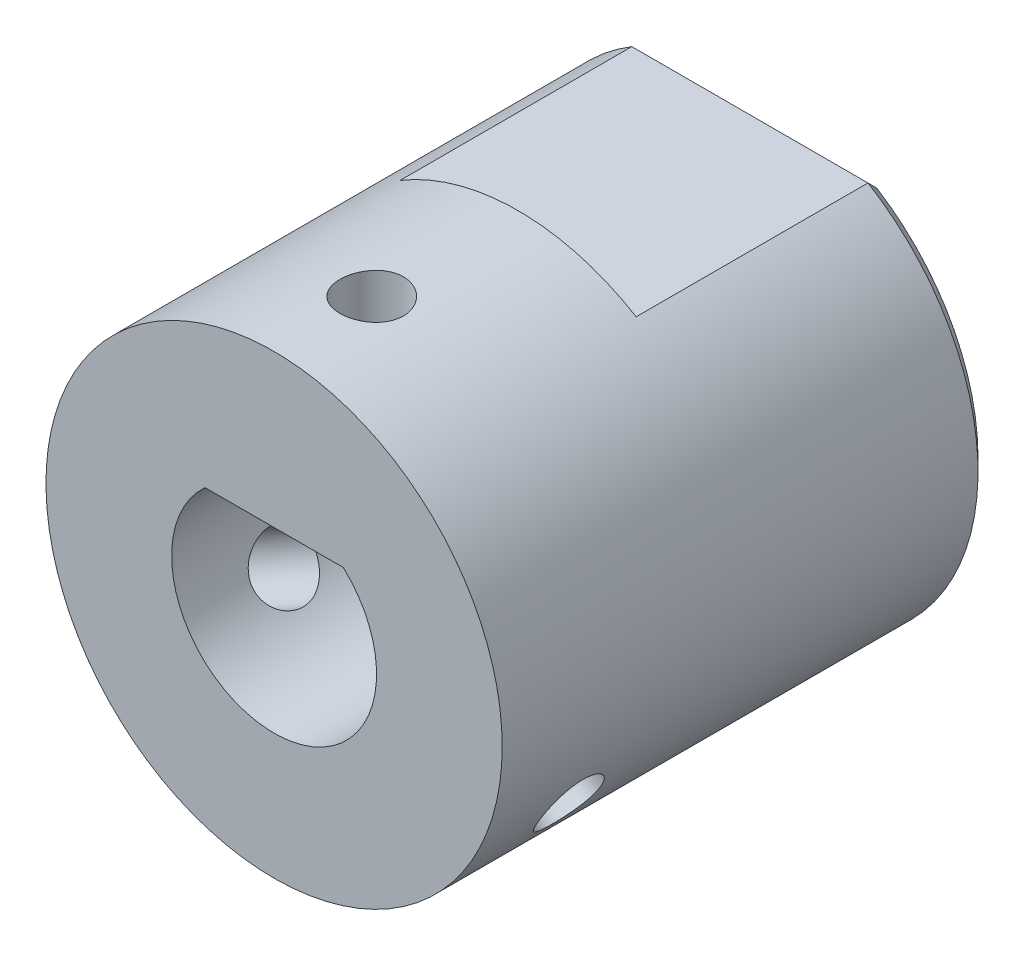
ISO-10303-21;
HEADER;
FILE_DESCRIPTION(('STEP AP214'),'2;1');
FILE_NAME('part.step','',(''),(''),'','','');
FILE_SCHEMA(('AUTOMOTIVE_DESIGN { 1 0 10303 214 1 1 1 1 }'));
ENDSEC;
DATA;
#1=APPLICATION_CONTEXT('core data for automotive mechanical design processes');
#2=APPLICATION_PROTOCOL_DEFINITION('international standard','automotive_design',2000,#1);
#3=PRODUCT_CONTEXT('',#1,'mechanical');
#4=PRODUCT('Part','Part','',(#3));
#5=PRODUCT_RELATED_PRODUCT_CATEGORY('part','',(#4));
#6=PRODUCT_DEFINITION_FORMATION('','',#4);
#7=PRODUCT_DEFINITION_CONTEXT('part definition',#1,'design');
#8=PRODUCT_DEFINITION('design','',#6,#7);
#9=PRODUCT_DEFINITION_SHAPE('','',#8);
#10=(LENGTH_UNIT() NAMED_UNIT(*) SI_UNIT(.MILLI.,.METRE.));
#11=(NAMED_UNIT(*) PLANE_ANGLE_UNIT() SI_UNIT($,.RADIAN.));
#12=(NAMED_UNIT(*) SI_UNIT($,.STERADIAN.) SOLID_ANGLE_UNIT());
#13=UNCERTAINTY_MEASURE_WITH_UNIT(LENGTH_MEASURE(1.E-05),#10,'distance_accuracy_value','');
#14=(GEOMETRIC_REPRESENTATION_CONTEXT(3) GLOBAL_UNCERTAINTY_ASSIGNED_CONTEXT((#13)) GLOBAL_UNIT_ASSIGNED_CONTEXT((#10,
#11,#12)) REPRESENTATION_CONTEXT('',''));
#15=CARTESIAN_POINT('',(0.,0.,0.));
#16=DIRECTION('',(0.,0.,1.));
#17=DIRECTION('',(1.,0.,0.));
#18=AXIS2_PLACEMENT_3D('',#15,#16,#17);
#19=CARTESIAN_POINT('',(0.,0.,20.));
#20=DIRECTION('',(0.,0.,1.));
#21=DIRECTION('',(1.,0.,0.));
#22=AXIS2_PLACEMENT_3D('',#19,#20,#21);
#23=PLANE('',#22);
#24=CARTESIAN_POINT('',(0.,0.,20.));
#25=DIRECTION('',(0.,0.,1.));
#26=DIRECTION('',(1.,0.,0.));
#27=AXIS2_PLACEMENT_3D('',#24,#25,#26);
#28=CIRCLE('',#27,9.35);
#29=CARTESIAN_POINT('',(9.35,0.,20.));
#30=VERTEX_POINT('',#29);
#31=EDGE_CURVE('E241',#30,#30,#28,.T.);
#32=ORIENTED_EDGE('',*,*,#31,.T.);
#33=EDGE_LOOP('',(#32));
#34=FACE_BOUND('',#33,.T.);
#35=CARTESIAN_POINT('',(0.,0.,20.));
#36=DIRECTION('',(0.,0.,1.));
#37=DIRECTION('',(1.,0.,0.));
#38=AXIS2_PLACEMENT_3D('',#35,#36,#37);
#39=CIRCLE('',#38,4.2);
#40=CARTESIAN_POINT('',(-2.83372546306095,3.1,20.));
#41=VERTEX_POINT('',#40);
#42=CARTESIAN_POINT('',(2.83372546306095,3.1,20.));
#43=VERTEX_POINT('',#42);
#44=EDGE_CURVE('E238',#41,#43,#39,.T.);
#45=ORIENTED_EDGE('',*,*,#44,.F.);
#46=DIRECTION('',(1.,0.,0.));
#47=VECTOR('',#46,1.);
#48=CARTESIAN_POINT('',(-2.83372546306095,3.1,20.));
#49=LINE('',#48,#47);
#50=EDGE_CURVE('E218',#41,#43,#49,.T.);
#51=ORIENTED_EDGE('',*,*,#50,.T.);
#52=EDGE_LOOP('',(#45,#51));
#53=FACE_BOUND('',#52,.T.);
#54=ADVANCED_FACE('F43',(#34,#53),#23,.T.);
#55=CARTESIAN_POINT('',(0.,0.,0.));
#56=DIRECTION('',(0.,0.,1.));
#57=DIRECTION('',(1.,0.,0.));
#58=AXIS2_PLACEMENT_3D('',#55,#56,#57);
#59=PLANE('',#58);
#60=DIRECTION('',(1.,0.,0.));
#61=VECTOR('',#60,1.);
#62=CARTESIAN_POINT('',(0.,7.5,0.));
#63=LINE('',#62,#61);
#64=CARTESIAN_POINT('',(-4.69813792900975,7.5,0.));
#65=VERTEX_POINT('',#64);
#66=CARTESIAN_POINT('',(4.69813792900975,7.5,0.));
#67=VERTEX_POINT('',#66);
#68=EDGE_CURVE('E66',#65,#67,#63,.T.);
#69=ORIENTED_EDGE('',*,*,#68,.T.);
#70=CARTESIAN_POINT('',(0.,0.,0.));
#71=DIRECTION('',(0.,0.,1.));
#72=DIRECTION('',(1.,0.,0.));
#73=AXIS2_PLACEMENT_3D('',#70,#71,#72);
#74=CIRCLE('',#73,8.85);
#75=EDGE_CURVE('E59',#67,#65,#74,.F.);
#76=ORIENTED_EDGE('',*,*,#75,.T.);
#77=EDGE_LOOP('',(#69,#76));
#78=FACE_BOUND('',#77,.T.);
#79=CARTESIAN_POINT('',(0.,0.,0.));
#80=DIRECTION('',(0.,0.,1.));
#81=DIRECTION('',(1.,0.,0.));
#82=AXIS2_PLACEMENT_3D('',#79,#80,#81);
#83=CIRCLE('',#82,4.2);
#84=CARTESIAN_POINT('',(4.2,0.,0.));
#85=VERTEX_POINT('',#84);
#86=EDGE_CURVE('E235',#85,#85,#83,.T.);
#87=ORIENTED_EDGE('',*,*,#86,.T.);
#88=EDGE_LOOP('',(#87));
#89=FACE_BOUND('',#88,.T.);
#90=ADVANCED_FACE('F152',(#78,#89),#59,.F.);
#91=CARTESIAN_POINT('',(0.,0.,20.));
#92=DIRECTION('',(0.,0.,-1.));
#93=DIRECTION('',(-1.,0.,0.));
#94=AXIS2_PLACEMENT_3D('',#91,#92,#93);
#95=CYLINDRICAL_SURFACE('',#94,9.35);
#96=CARTESIAN_POINT('',(-7.36868910732917,-5.75542533958424,16.));
#97=CARTESIAN_POINT('',(-7.36869161852359,-5.75542327536056,15.9273580817023));
#98=CARTESIAN_POINT('',(-7.37249205819785,-5.75056663106929,15.8546725031694));
#99=CARTESIAN_POINT('',(-7.38752877458161,-5.73123571250505,15.7113292392381));
#100=CARTESIAN_POINT('',(-7.39877254227632,-5.71675174921273,15.6406736716695));
#101=CARTESIAN_POINT('',(-7.4281713888277,-5.67849873812206,15.5034862737632));
#102=CARTESIAN_POINT('',(-7.44632144628477,-5.65473643605633,15.4369514880746));
#103=CARTESIAN_POINT('',(-7.48872710108576,-5.5984553285125,15.3098130770295));
#104=CARTESIAN_POINT('',(-7.51298176464104,-5.5659378622116,15.2492085465212));
#105=CARTESIAN_POINT('',(-7.56674187650696,-5.49263053118961,15.1352223541864));
#106=CARTESIAN_POINT('',(-7.59627876344121,-5.45179091990007,15.0818875076751));
#107=CARTESIAN_POINT('',(-7.65930656056571,-5.36288043086562,14.9843597717681));
#108=CARTESIAN_POINT('',(-7.69279767829316,-5.31480917353253,14.9401673625472));
#109=CARTESIAN_POINT('',(-7.76259046394222,-5.21234511377049,14.8620082778028));
#110=CARTESIAN_POINT('',(-7.7989031222667,-5.15792713064914,14.8280843964996));
#111=CARTESIAN_POINT('',(-7.872882762299,-5.04428474668086,14.7716997184414));
#112=CARTESIAN_POINT('',(-7.91054968220607,-4.98506056500665,14.7492383993095));
#113=CARTESIAN_POINT('',(-7.98569423778917,-4.8637682730505,14.7165574853382));
#114=CARTESIAN_POINT('',(-8.02317152357426,-4.80172101536436,14.7062597155207));
#115=CARTESIAN_POINT('',(-8.09699915888118,-4.67615306950701,14.6979556900775));
#116=CARTESIAN_POINT('',(-8.13334956254551,-4.61263245238237,14.6999488429961));
#117=CARTESIAN_POINT('',(-8.20365272098632,-4.48639807869262,14.7161079523771));
#118=CARTESIAN_POINT('',(-8.23762028932464,-4.42368177902195,14.730189818852));
#119=CARTESIAN_POINT('',(-8.30261416559337,-4.3004596788589,14.7699948790985));
#120=CARTESIAN_POINT('',(-8.33364040667508,-4.23995392862575,14.7957183373765));
#121=CARTESIAN_POINT('',(-8.39222830625282,-4.12277982747407,14.8581640030411));
#122=CARTESIAN_POINT('',(-8.41977824822696,-4.06612473598641,14.8949220653752));
#123=CARTESIAN_POINT('',(-8.47085916757039,-3.95861000670828,14.9783673814475));
#124=CARTESIAN_POINT('',(-8.49438991708336,-3.90775069754703,15.0250551977874));
#125=CARTESIAN_POINT('',(-8.53733280644675,-3.81302784862582,15.127504352275));
#126=CARTESIAN_POINT('',(-8.55670845159298,-3.76922707598977,15.1833390506139));
#127=CARTESIAN_POINT('',(-8.59091844955918,-3.69059139788764,15.3022465194326));
#128=CARTESIAN_POINT('',(-8.60575278135189,-3.65575653393576,15.3653193234245));
#129=CARTESIAN_POINT('',(-8.63079857185777,-3.59622922549149,15.4969832050296));
#130=CARTESIAN_POINT('',(-8.64100723825642,-3.57154290806992,15.56557758644));
#131=CARTESIAN_POINT('',(-8.6567450367552,-3.53322775971783,15.7062998571695));
#132=CARTESIAN_POINT('',(-8.66227445019601,-3.51959826399654,15.7784275337729));
#133=CARTESIAN_POINT('',(-8.66861100469175,-3.50396275127043,15.9235251581154));
#134=CARTESIAN_POINT('',(-8.66945712517172,-3.50186079101088,15.9964830731419));
#135=CARTESIAN_POINT('',(-8.66652957502623,-3.50909956705879,16.1417337618307));
#136=CARTESIAN_POINT('',(-8.6627560269497,-3.51843999982652,16.2140265530861));
#137=CARTESIAN_POINT('',(-8.6506259847929,-3.54815772103816,16.3555818705303));
#138=CARTESIAN_POINT('',(-8.64228899861504,-3.56848802512971,16.4248559497771));
#139=CARTESIAN_POINT('',(-8.62107519353809,-3.61943634671632,16.5587703985755));
#140=CARTESIAN_POINT('',(-8.60819817982956,-3.65005480566632,16.6234105691461));
#141=CARTESIAN_POINT('',(-8.57787105725553,-3.72076768358883,16.7466841047076));
#142=CARTESIAN_POINT('',(-8.56039177170221,-3.76092239365305,16.8052757012172));
#143=CARTESIAN_POINT('',(-8.52102951761476,-3.84927121357059,16.9143609886034));
#144=CARTESIAN_POINT('',(-8.49914633609116,-3.89746571223994,16.9648542876027));
#145=CARTESIAN_POINT('',(-8.45103497997615,-4.00072100536017,17.0566743471355));
#146=CARTESIAN_POINT('',(-8.4247770223437,-4.05582817729574,17.0979333899061));
#147=CARTESIAN_POINT('',(-8.36840823436111,-4.17089224678479,17.1696434433863));
#148=CARTESIAN_POINT('',(-8.33829749702341,-4.23084902724791,17.2000947149462));
#149=CARTESIAN_POINT('',(-8.2748919712809,-4.35355169540655,17.2492149499628));
#150=CARTESIAN_POINT('',(-8.24160785549086,-4.41628787918661,17.2679219062292));
#151=CARTESIAN_POINT('',(-8.17254121404812,-4.5428253762431,17.2931457579287));
#152=CARTESIAN_POINT('',(-8.13675882933008,-4.60662662928162,17.2996633404244));
#153=CARTESIAN_POINT('',(-8.06397359044995,-4.73287386206785,17.3003084752526));
#154=CARTESIAN_POINT('',(-8.02698356664508,-4.7953267325754,17.2945400051509));
#155=CARTESIAN_POINT('',(-7.95261128694535,-4.917682498107,17.2709984310592));
#156=CARTESIAN_POINT('',(-7.91522903181739,-4.97758539811569,17.2532253505366));
#157=CARTESIAN_POINT('',(-7.84131936401621,-5.09322304245144,17.2062140494977));
#158=CARTESIAN_POINT('',(-7.80479150106602,-5.14896001791176,17.1769820191736));
#159=CARTESIAN_POINT('',(-7.73384807434369,-5.25491811227909,17.1078934999697));
#160=CARTESIAN_POINT('',(-7.69943255946492,-5.30513910353183,17.0680367652795));
#161=CARTESIAN_POINT('',(-7.63372251424288,-5.39926913733651,16.9784500733686));
#162=CARTESIAN_POINT('',(-7.6024554130637,-5.44312396889629,16.9286430311121));
#163=CARTESIAN_POINT('',(-7.54459387773939,-5.52304663826848,16.8207312979333));
#164=CARTESIAN_POINT('',(-7.51800054568014,-5.55911263991374,16.7626246557852));
#165=CARTESIAN_POINT('',(-7.47049249487425,-5.62279580443319,16.6394389072019));
#166=CARTESIAN_POINT('',(-7.44960558447255,-5.65037167338479,16.5743277384333));
#167=CARTESIAN_POINT('',(-7.41462508324013,-5.69619814679963,16.4392383172415));
#168=CARTESIAN_POINT('',(-7.40052428655317,-5.71445864406205,16.3692653181534));
#169=CARTESIAN_POINT('',(-7.38303433132624,-5.73702290061459,16.2491293310254));
#170=CARTESIAN_POINT('',(-7.37766670707216,-5.74391576712819,16.1997160284586));
#171=CARTESIAN_POINT('',(-7.37049324720049,-5.75311767504155,16.1002087392048));
#172=CARTESIAN_POINT('',(-7.36868737488726,-5.75542676366658,16.0501147595359));
#173=CARTESIAN_POINT('',(-7.36868910732917,-5.75542533958424,16.));
#174=B_SPLINE_CURVE_WITH_KNOTS('',3,(#96,#97,#98,#99,#100,#101,#102,#103,#104,#105,#106,#107,
#108,#109,#110,#111,#112,#113,#114,#115,#116,#117,#118,#119,#120,#121,#122,#123,#124,#125,#126,
#127,#128,#129,#130,#131,#132,#133,#134,#135,#136,#137,#138,#139,#140,#141,#142,#143,#144,#145,
#146,#147,#148,#149,#150,#151,#152,#153,#154,#155,#156,#157,#158,#159,#160,#161,#162,#163,#164,
#165,#166,#167,#168,#169,#170,#171,#172,#173),.UNSPECIFIED.,.T.,.F.,(4,2,2,2,2,2,2,2,2,2,2,2,2,
2,2,2,2,2,2,2,2,2,2,2,2,2,2,2,2,2,2,2,2,2,2,2,2,2,4),(0.,0.217742626385451,0.435704723355003,
0.653508647129262,0.871279274839773,1.09039199177471,1.30951621392374,1.52954144950692,
1.74955665711069,1.96814999973307,2.18673282343286,2.40380737639634,2.62088686171712,
2.83867948610532,3.05648445351163,3.2761304659841,3.49577749544925,3.71555694027489,
3.93532316989455,4.15325748540633,4.37118601975961,4.58819014178226,4.80520357643453,
5.02362738281834,5.24206175556317,5.46204900073356,5.68203093605196,5.90129751325707,
6.12055173097251,6.33795776448628,6.55536337299864,6.77265169920594,6.98994505297324,
7.20899205346611,7.42809063666344,7.64823861445149,7.86815230879066,8.01837179698311,
8.16858973750186),.UNSPECIFIED.);
#175=CARTESIAN_POINT('',(-7.36868910732917,-5.75542533958424,16.));
#176=VERTEX_POINT('',#175);
#177=EDGE_CURVE('E185',#176,#176,#174,.T.);
#178=ORIENTED_EDGE('',*,*,#177,.T.);
#179=EDGE_LOOP('',(#178));
#180=FACE_BOUND('',#179,.T.);
#181=CARTESIAN_POINT('',(8.66868910732924,-3.50375928974458,16.));
#182=CARTESIAN_POINT('',(8.6686885752563,-3.50376249661457,15.9273580817023));
#183=CARTESIAN_POINT('',(8.66638281776004,-3.50948209606367,15.8546725031694));
#184=CARTESIAN_POINT('',(8.6571601093968,-3.53216973372363,15.7113292392381));
#185=CARTESIAN_POINT('',(8.65023851308552,-3.54914910382767,15.6406736716695));
#186=CARTESIAN_POINT('',(8.63180985698545,-3.59373575732845,15.5034862737632));
#187=CARTESIAN_POINT('',(8.62030612847266,-3.62133531919929,15.4369514880746));
#188=CARTESIAN_POINT('',(8.59276808698708,-3.68620024729297,15.3098130770295));
#189=CARTESIAN_POINT('',(8.57673446688143,-3.72346413524254,15.2492085465212));
#190=CARTESIAN_POINT('',(8.54012851186572,-3.80667542333972,15.1352223541864));
#191=CARTESIAN_POINT('',(8.51952881447542,-3.85267492341826,15.0818875076751));
#192=CARTESIAN_POINT('',(8.47404397087093,-3.95171384138987,14.9843597717681));
#193=CARTESIAN_POINT('',(8.44915859969234,-4.00475362880952,14.9401673625472));
#194=CARTESIAN_POINT('',(8.39531851378806,-4.11642798406351,14.8620082778028));
#195=CARTESIAN_POINT('',(8.36634748714451,-4.17508466021213,14.8280843964997));
#196=CARTESIAN_POINT('',(8.3049201156975,-4.29597409982707,14.7716997184414));
#197=CARTESIAN_POINT('',(8.27246392980282,-4.35820670018601,14.7492383993095));
#198=CARTESIAN_POINT('',(8.20499400147711,-4.48392994025515,14.7165574853382));
#199=CARTESIAN_POINT('',(8.1699981429783,-4.54740985065299,14.7062597155207));
#200=CARTESIAN_POINT('',(8.09816692961826,-4.6741304312588,14.6979556900775));
#201=CARTESIAN_POINT('',(8.06133166335642,-4.73737111283224,14.6999488429961));
#202=CARTESIAN_POINT('',(7.98716106813068,-4.86137262085314,14.7161079523771));
#203=CARTESIAN_POINT('',(7.94983094355369,-4.92214754777425,14.730189818852));
#204=CARTESIAN_POINT('',(7.87561441263918,-5.04004494579492,14.7699948790985));
#205=CARTESIAN_POINT('',(7.8387280164031,-5.09716733387219,14.7957183373765));
#206=CARTESIAN_POINT('',(7.766546217929,-5.20649299383672,14.8581640030411));
#207=CARTESIAN_POINT('',(7.73125644043403,-5.25867948920294,14.8949220653752));
#208=CARTESIAN_POINT('',(7.66368641326988,-5.35667422764208,14.9783673814475));
#209=CARTESIAN_POINT('',(7.63140633427379,-5.40248210907103,15.0250551977874));
#210=CARTESIAN_POINT('',(7.57084538547088,-5.48703316663223,15.127504352275));
#211=CARTESIAN_POINT('',(7.5426006262358,-5.52571335386161,15.1833390506139));
#212=CARTESIAN_POINT('',(7.49160513033864,-5.59465792021482,15.3022465194326));
#213=CARTESIAN_POINT('',(7.46885441911529,-5.62492226037142,15.3653193234245));
#214=CARTESIAN_POINT('',(7.42982515303658,-5.6763762054295,15.4969832050296));
#215=CARTESIAN_POINT('',(7.41355050822294,-5.69756032858027,15.56557758644));
#216=CARTESIAN_POINT('',(7.38823751564965,-5.73034723605591,15.7062998571695));
#217=CARTESIAN_POINT('',(7.37919873283465,-5.74195059642432,15.7784275337729));
#218=CARTESIAN_POINT('',(7.3688262588605,-5.75525596995316,15.9235251581154));
#219=CARTESIAN_POINT('',(7.36742896811798,-5.75703971191324,15.9964830731419));
#220=CARTESIAN_POINT('',(7.37223415699503,-5.75088499109244,16.1417337618307));
#221=CARTESIAN_POINT('',(7.37843643501596,-5.7429467862119,16.2140265530861));
#222=CARTESIAN_POINT('',(7.39810771544942,-5.71758300094932,16.3555818705303));
#223=CARTESIAN_POINT('',(7.41154578217044,-5.70019780708251,16.4248559497771));
#224=CARTESIAN_POINT('',(7.44506142040615,-5.65635195218163,16.5587703985755));
#225=CARTESIAN_POINT('',(7.46513927682731,-5.62989090171017,16.6234105691461));
#226=CARTESIAN_POINT('',(7.5112148641959,-5.56827040417612,16.7466841047076));
#227=CARTESIAN_POINT('',(7.53725022041645,-5.53305554381483,16.8052757012172));
#228=CARTESIAN_POINT('',(7.59408141581569,-5.45479242186611,16.9143609886034));
#229=CARTESIAN_POINT('',(7.62487748522421,-5.41174378141637,16.9648542876027));
#230=CARTESIAN_POINT('',(7.69024351408402,-5.31845047825014,17.0566743471355));
#231=CARTESIAN_POINT('',(7.72483874609472,-5.26815683392115,17.0979333899061));
#232=CARTESIAN_POINT('',(7.79630275934376,-5.16180799680317,17.1696434433863));
#233=CARTESIAN_POINT('',(7.8331714856851,-5.10575294311048,17.2000947149462));
#234=CARTESIAN_POINT('',(7.90773235055137,-4.98949081299784,17.2492149499628));
#235=CARTESIAN_POINT('',(7.94542142154636,-4.92929783129113,17.2679219062292));
#236=CARTESIAN_POINT('',(8.02047278780721,-4.80621561671939,17.2931457579287));
#237=CARTESIAN_POINT('',(8.05783510137282,-4.74332653602632,17.2996633404244));
#238=CARTESIAN_POINT('',(8.13077579268312,-4.61716905374251,17.3003084752526));
#239=CARTESIAN_POINT('',(8.16636655317949,-4.55390831818712,17.2945400051509));
#240=CARTESIAN_POINT('',(8.23514361457948,-4.42832215186399,17.2709984310592));
#241=CARTESIAN_POINT('',(8.26832992018338,-4.36599671926808,17.2532253505366));
#242=CARTESIAN_POINT('',(8.33152022391134,-4.24417024719911,17.2062140494977));
#243=CARTESIAN_POINT('',(8.36152592911499,-4.18466770220814,17.1769820191736));
#244=CARTESIAN_POINT('',(8.41781661721252,-4.07024984525141,17.1078934999697));
#245=CARTESIAN_POINT('',(8.44410151400125,-4.01533463945571,17.0680367652795));
#246=CARTESIAN_POINT('',(8.49276549192417,-3.91136305410726,16.9784500733686));
#247=CARTESIAN_POINT('',(8.51511133954403,-3.86235753440349,16.9286430311121));
#248=CARTESIAN_POINT('',(8.55539563389646,-3.77228664022458,16.8207312979333));
#249=CARTESIAN_POINT('',(8.57333304150456,-3.73122313826736,16.7626246557852));
#250=CARTESIAN_POINT('',(8.60473025436885,-3.65823837712545,16.6394389072019));
#251=CARTESIAN_POINT('',(8.61816820221151,-3.62636184763522,16.5743277384333));
#252=CARTESIAN_POINT('',(8.6403648417384,-3.5731546082234,16.4392383172415));
#253=CARTESIAN_POINT('',(8.64912849790991,-3.55181271144768,16.3692653181534));
#254=CARTESIAN_POINT('',(8.65992473968846,-3.52538383763385,16.2491293310254));
#255=CARTESIAN_POINT('',(8.66321032506709,-3.51728890541504,16.1997160284586));
#256=CARTESIAN_POINT('',(8.66759268114751,-3.50647555297647,16.1002087392048));
#257=CARTESIAN_POINT('',(8.66868947439976,-3.5037570773647,16.0501147595359));
#258=CARTESIAN_POINT('',(8.66868910732924,-3.50375928974458,16.));
#259=B_SPLINE_CURVE_WITH_KNOTS('',3,(#181,#182,#183,#184,#185,#186,#187,#188,#189,#190,#191,
#192,#193,#194,#195,#196,#197,#198,#199,#200,#201,#202,#203,#204,#205,#206,#207,#208,#209,#210,
#211,#212,#213,#214,#215,#216,#217,#218,#219,#220,#221,#222,#223,#224,#225,#226,#227,#228,#229,
#230,#231,#232,#233,#234,#235,#236,#237,#238,#239,#240,#241,#242,#243,#244,#245,#246,#247,#248,
#249,#250,#251,#252,#253,#254,#255,#256,#257,#258),.UNSPECIFIED.,.T.,.F.,(4,2,2,2,2,2,2,2,2,2,2,
2,2,2,2,2,2,2,2,2,2,2,2,2,2,2,2,2,2,2,2,2,2,2,2,2,2,2,4),(0.,0.217742626385451,
0.435704723355003,0.653508647129263,0.871279274839775,1.09039199177471,1.30951621392374,
1.52954144950692,1.74955665711069,1.96814999973307,2.18673282343287,2.40380737639634,
2.62088686171713,2.83867948610532,3.05648445351163,3.2761304659841,3.49577749544925,
3.71555694027489,3.93532316989455,4.15325748540634,4.37118601975962,4.58819014178226,
4.80520357643453,5.02362738281834,5.24206175556318,5.46204900073356,5.68203093605196,
5.90129751325707,6.12055173097252,6.33795776448628,6.55536337299864,6.77265169920593,
6.98994505297324,7.20899205346611,7.42809063666344,7.64823861445149,7.86815230879066,
8.01837179698311,8.16858973750186),.UNSPECIFIED.);
#260=CARTESIAN_POINT('',(8.66868910732924,-3.50375928974458,16.));
#261=VERTEX_POINT('',#260);
#262=EDGE_CURVE('E132',#261,#261,#259,.T.);
#263=ORIENTED_EDGE('',*,*,#262,.T.);
#264=EDGE_LOOP('',(#263));
#265=FACE_BOUND('',#264,.T.);
#266=CARTESIAN_POINT('',(0.,9.35,17.3));
#267=CARTESIAN_POINT('',(-0.072645744301068,9.34999889789732,17.2999969600503));
#268=CARTESIAN_POINT('',(-0.145335138117886,9.34914445297327,17.2938901413563));
#269=CARTESIAN_POINT('',(-0.288686327944789,9.3458181143894,17.2696280237627));
#270=CARTESIAN_POINT('',(-0.359346009149375,9.34334459334251,17.2514606020901));
#271=CARTESIAN_POINT('',(-0.496542109625203,9.33705838755784,17.2036270813335));
#272=CARTESIAN_POINT('',(-0.563081449422424,9.33324666442978,17.1739692374949));
#273=CARTESIAN_POINT('',(-0.690227506488369,9.3247065100042,17.1040159821204));
#274=CARTESIAN_POINT('',(-0.750835134447861,9.31997821975975,17.0637222070332));
#275=CARTESIAN_POINT('',(-0.864817892284399,9.31009600124959,16.9733505664938));
#276=CARTESIAN_POINT('',(-0.918147173082514,9.3049396767671,16.9232151291365));
#277=CARTESIAN_POINT('',(-1.01566414898786,9.29480155196962,16.8147071276601));
#278=CARTESIAN_POINT('',(-1.05985134682724,9.28981976116032,16.7563341157627));
#279=CARTESIAN_POINT('',(-1.13800493177202,9.28057139936116,16.6327043532739));
#280=CARTESIAN_POINT('',(-1.17192758130507,9.276307922368,16.5674197021468));
#281=CARTESIAN_POINT('',(-1.22830971643479,9.26901118842819,16.4320105928707));
#282=CARTESIAN_POINT('',(-1.25076973853025,9.26597787390618,16.3618863614087));
#283=CARTESIAN_POINT('',(-1.28344801626508,9.26150820343863,16.2192681755559));
#284=CARTESIAN_POINT('',(-1.29374430842149,9.2600616718027,16.1467924263765));
#285=CARTESIAN_POINT('',(-1.30204447572124,9.25889835840987,16.001128458452));
#286=CARTESIAN_POINT('',(-1.30004895888108,9.25918149109483,15.9279402751263));
#287=CARTESIAN_POINT('',(-1.28388605616382,9.26143620571959,15.7834768103741));
#288=CARTESIAN_POINT('',(-1.26980514183888,9.26339579223777,15.7121916402926));
#289=CARTESIAN_POINT('',(-1.23000630694488,9.26876389649811,15.573005785181));
#290=CARTESIAN_POINT('',(-1.20428809989078,9.27217244991058,15.5051051835174));
#291=CARTESIAN_POINT('',(-1.14185341001958,9.28006784588072,15.3743502714116));
#292=CARTESIAN_POINT('',(-1.10509986416463,9.28455831192389,15.3115138860919));
#293=CARTESIAN_POINT('',(-1.02166424314281,9.29410887480316,15.1928677027017));
#294=CARTESIAN_POINT('',(-0.974981607033082,9.2991690038147,15.1370583019035));
#295=CARTESIAN_POINT('',(-0.872536191208854,9.30934190037761,15.033548802768));
#296=CARTESIAN_POINT('',(-0.816698977846385,9.31445474721343,14.9859223498015));
#297=CARTESIAN_POINT('',(-0.697784299406315,9.3241165608295,14.9007058412347));
#298=CARTESIAN_POINT('',(-0.634706810165325,9.32866552572777,14.863115819131));
#299=CARTESIAN_POINT('',(-0.503041527170945,9.33669085225137,14.7990371538669));
#300=CARTESIAN_POINT('',(-0.434451175800103,9.34016671236178,14.7725536992888));
#301=CARTESIAN_POINT('',(-0.293737684294615,9.34564986025001,14.7315013926417));
#302=CARTESIAN_POINT('',(-0.221614749343567,9.34765723321452,14.7169318494429));
#303=CARTESIAN_POINT('',(-0.0765195379486819,9.34996604673329,14.7002177274884));
#304=CARTESIAN_POINT('',(-0.00355914821858089,9.3502814006219,14.6979718090921));
#305=CARTESIAN_POINT('',(0.14169708714966,9.34920837610311,14.7057004169471));
#306=CARTESIAN_POINT('',(0.213992950337465,9.34782004281986,14.7156746195342));
#307=CARTESIAN_POINT('',(0.355564611267121,9.34350426127591,14.7474761005173));
#308=CARTESIAN_POINT('',(0.424851601068134,9.34058316275321,14.7692544902562));
#309=CARTESIAN_POINT('',(0.558790399763558,9.33352855415569,14.8239949172963));
#310=CARTESIAN_POINT('',(0.623442017954021,9.32939499423454,14.8569574144039));
#311=CARTESIAN_POINT('',(0.746723690282323,9.32034082557225,14.9333715375513));
#312=CARTESIAN_POINT('',(0.805313177225959,9.31541541546312,14.976888033063));
#313=CARTESIAN_POINT('',(0.914393348316659,9.30534207366746,15.0730838989198));
#314=CARTESIAN_POINT('',(0.964883630909442,9.30019413096393,15.1257637233081));
#315=CARTESIAN_POINT('',(1.05669668967308,9.29021235191874,15.2392398647354));
#316=CARTESIAN_POINT('',(1.09795187493452,9.28538100353209,15.3000911207775));
#317=CARTESIAN_POINT('',(1.16965516688593,9.27662207559168,15.4279189799284));
#318=CARTESIAN_POINT('',(1.20010353211015,9.27269447441812,15.4948954364543));
#319=CARTESIAN_POINT('',(1.24922194549929,9.26620529562485,15.632863335673));
#320=CARTESIAN_POINT('',(1.26792872837458,9.26363946151143,15.7038414914223));
#321=CARTESIAN_POINT('',(1.29315055131651,9.26015261610441,15.8479700178537));
#322=CARTESIAN_POINT('',(1.29966630542657,9.25923150847733,15.9211202610591));
#323=CARTESIAN_POINT('',(1.30030590927431,9.25914165149226,16.0668434247066));
#324=CARTESIAN_POINT('',(1.29453598624242,9.25995788035624,16.1394158922296));
#325=CARTESIAN_POINT('',(1.27099442340725,9.26321824380354,16.2825482261076));
#326=CARTESIAN_POINT('',(1.25322279264419,9.26566237716066,16.3531080939784));
#327=CARTESIAN_POINT('',(1.20621788563937,9.27189818389771,16.4901899263735));
#328=CARTESIAN_POINT('',(1.17699098187205,9.27568910795949,16.5567141121955));
#329=CARTESIAN_POINT('',(1.10791563501676,9.28419240457501,16.6839315874799));
#330=CARTESIAN_POINT('',(1.06806693547481,9.28890479937612,16.7446247361088));
#331=CARTESIAN_POINT('',(0.978489317239316,9.29876873843837,16.8589986183772));
#332=CARTESIAN_POINT('',(0.92868146105594,9.30392359034749,16.9126172488335));
#333=CARTESIAN_POINT('',(0.82076573059315,9.31406326432578,17.0107741631373));
#334=CARTESIAN_POINT('',(0.762655918391663,9.3190480463581,17.0553103209582));
#335=CARTESIAN_POINT('',(0.639467357652061,9.32831236667457,17.1342216956354));
#336=CARTESIAN_POINT('',(0.574357124696726,9.33258847855253,17.1685481491012));
#337=CARTESIAN_POINT('',(0.439269636414646,9.33991967729228,17.2257285281369));
#338=CARTESIAN_POINT('',(0.36929762647656,9.34297605682901,17.2485946060513));
#339=CARTESIAN_POINT('',(0.249157335764946,9.34680762989039,17.2768851814703));
#340=CARTESIAN_POINT('',(0.19973843492336,9.34799876722862,17.2855403595337));
#341=CARTESIAN_POINT('',(0.100219943947314,9.34959532856439,17.2970987888853));
#342=CARTESIAN_POINT('',(0.0501203605838904,9.35000076037191,17.3000020973475));
#343=CARTESIAN_POINT('',(0.,9.35,17.3));
#344=B_SPLINE_CURVE_WITH_KNOTS('',3,(#266,#267,#268,#269,#270,#271,#272,#273,#274,#275,#276,
#277,#278,#279,#280,#281,#282,#283,#284,#285,#286,#287,#288,#289,#290,#291,#292,#293,#294,#295,
#296,#297,#298,#299,#300,#301,#302,#303,#304,#305,#306,#307,#308,#309,#310,#311,#312,#313,#314,
#315,#316,#317,#318,#319,#320,#321,#322,#323,#324,#325,#326,#327,#328,#329,#330,#331,#332,#333,
#334,#335,#336,#337,#338,#339,#340,#341,#342,#343),.UNSPECIFIED.,.T.,.F.,(4,2,2,2,2,2,2,2,2,2,2,
2,2,2,2,2,2,2,2,2,2,2,2,2,2,2,2,2,2,2,2,2,2,2,2,2,2,2,4),(0.,0.217754121272801,
0.435727451221452,0.653544468682809,0.87132799224679,1.09042566296466,1.30953524799141,
1.52956572844432,1.74958590960818,1.96818674860109,2.18677677455202,2.4038156948383,
2.62085995844519,2.8386414948083,3.05643533798522,3.27609686911334,3.49575913335182,
3.71552390176684,3.93527592065294,4.15321813566786,4.37115457835343,4.58819522866716,
4.80524480313843,5.02366386359615,5.24209374981095,5.46207352468134,5.68204803656571,
5.90133086019899,6.12060083976773,6.33798261982004,6.55536423613124,6.77262509607611,
6.98989120206946,7.20895300187745,7.42806602099316,7.64820935104522,7.868118749164,
8.01835499037632,8.16858973821771),.UNSPECIFIED.);
#345=CARTESIAN_POINT('',(0.,9.35,17.3));
#346=VERTEX_POINT('',#345);
#347=EDGE_CURVE('E173',#346,#346,#344,.T.);
#348=ORIENTED_EDGE('',*,*,#347,.T.);
#349=EDGE_LOOP('',(#348));
#350=FACE_BOUND('',#349,.T.);
#351=ORIENTED_EDGE('',*,*,#31,.F.);
#352=EDGE_LOOP('',(#351));
#353=FACE_BOUND('',#352,.T.);
#354=DIRECTION('',(0.,0.,-1.));
#355=VECTOR('',#354,1.);
#356=CARTESIAN_POINT('',(-4.8396797414705,8.,10.));
#357=LINE('',#356,#355);
#358=CARTESIAN_POINT('',(-4.8396797414705,8.,10.));
#359=VERTEX_POINT('',#358);
#360=CARTESIAN_POINT('',(-4.8396797414705,8.,0.499999999999997));
#361=VERTEX_POINT('',#360);
#362=EDGE_CURVE('E111',#359,#361,#357,.T.);
#363=ORIENTED_EDGE('',*,*,#362,.T.);
#364=CARTESIAN_POINT('',(0.,0.,0.499999999999997));
#365=DIRECTION('',(0.,0.,1.));
#366=DIRECTION('',(1.,0.,0.));
#367=AXIS2_PLACEMENT_3D('',#364,#365,#366);
#368=CIRCLE('',#367,9.35);
#369=CARTESIAN_POINT('',(4.8396797414705,8.,0.499999999999997));
#370=VERTEX_POINT('',#369);
#371=EDGE_CURVE('E116',#361,#370,#368,.T.);
#372=ORIENTED_EDGE('',*,*,#371,.T.);
#373=DIRECTION('',(0.,0.,-1.));
#374=VECTOR('',#373,1.);
#375=CARTESIAN_POINT('',(4.8396797414705,8.,10.));
#376=LINE('',#375,#374);
#377=CARTESIAN_POINT('',(4.8396797414705,8.,10.));
#378=VERTEX_POINT('',#377);
#379=EDGE_CURVE('E110',#378,#370,#376,.T.);
#380=ORIENTED_EDGE('',*,*,#379,.F.);
#381=CARTESIAN_POINT('',(0.,0.,10.));
#382=DIRECTION('',(0.,0.,-1.));
#383=DIRECTION('',(1.,0.,0.));
#384=AXIS2_PLACEMENT_3D('',#381,#382,#383);
#385=CIRCLE('',#384,9.35);
#386=EDGE_CURVE('E97',#359,#378,#385,.T.);
#387=ORIENTED_EDGE('',*,*,#386,.F.);
#388=EDGE_LOOP('',(#363,#372,#380,#387));
#389=FACE_BOUND('',#388,.T.);
#390=ADVANCED_FACE('F115',(#180,#265,#350,#353,#389),#95,.T.);
#391=CARTESIAN_POINT('',(0.,0.,20.));
#392=DIRECTION('',(0.,0.,-1.));
#393=DIRECTION('',(-1.,0.,0.));
#394=AXIS2_PLACEMENT_3D('',#391,#392,#393);
#395=CYLINDRICAL_SURFACE('',#394,4.2);
#396=CARTESIAN_POINT('',(-2.80868472110424,-3.12270557969137,16.));
#397=CARTESIAN_POINT('',(-2.8086854589943,-3.1227053328882,16.0711182789516));
#398=CARTESIAN_POINT('',(-2.81327574418197,-3.11859456301317,16.1422423858663));
#399=CARTESIAN_POINT('',(-2.8313184752757,-3.10222178979256,16.2824035238243));
#400=CARTESIAN_POINT('',(-2.84477345085774,-3.08995745969389,16.3514399532334));
#401=CARTESIAN_POINT('',(-2.87962750819097,-3.05750003745497,16.4853755441972));
#402=CARTESIAN_POINT('',(-2.90101273558782,-3.03732076938772,16.5502816911323));
#403=CARTESIAN_POINT('',(-2.95046735553792,-2.9893018953038,16.6744645048396));
#404=CARTESIAN_POINT('',(-2.97853788610822,-2.96146098494549,16.7337402107547));
#405=CARTESIAN_POINT('',(-3.04083622174066,-2.89747551063115,16.8469769749778));
#406=CARTESIAN_POINT('',(-3.07522593132573,-2.86110325689743,16.9007203524921));
#407=CARTESIAN_POINT('',(-3.14784776796026,-2.78100217745463,16.9994236278836));
#408=CARTESIAN_POINT('',(-3.18608041994001,-2.7372723461791,17.044382323333));
#409=CARTESIAN_POINT('',(-3.26552300808585,-2.64202266130551,17.1251968940862));
#410=CARTESIAN_POINT('',(-3.30678012805011,-2.59035173747611,17.160829129524));
#411=CARTESIAN_POINT('',(-3.38963389955781,-2.48094387369448,17.2205078566337));
#412=CARTESIAN_POINT('',(-3.43123047064454,-2.42320833474992,17.2445570170132));
#413=CARTESIAN_POINT('',(-3.51175901906879,-2.30488873202436,17.2796616633434));
#414=CARTESIAN_POINT('',(-3.55073354798398,-2.2444441532302,17.291089084066));
#415=CARTESIAN_POINT('',(-3.6259213500161,-2.12083069230642,17.3018037381337));
#416=CARTESIAN_POINT('',(-3.6621352374664,-2.05766242121516,17.3010936804345));
#417=CARTESIAN_POINT('',(-3.72954664883329,-1.93270654636841,17.2877994097153));
#418=CARTESIAN_POINT('',(-3.76087255470787,-1.87094466886492,17.2756182887266));
#419=CARTESIAN_POINT('',(-3.81931736086078,-1.74854712485567,17.2403883577342));
#420=CARTESIAN_POINT('',(-3.84643598840819,-1.68791153158379,17.2173388435931));
#421=CARTESIAN_POINT('',(-3.89651648535565,-1.56887947945632,17.1607640750557));
#422=CARTESIAN_POINT('',(-3.9194240814104,-1.51051899650781,17.1271154262428));
#423=CARTESIAN_POINT('',(-3.96074498886914,-1.39859348446893,17.0503962011601));
#424=CARTESIAN_POINT('',(-3.97915717796214,-1.34502965500714,17.0073232771304));
#425=CARTESIAN_POINT('',(-4.01244723166045,-1.24229790564368,16.9109035589498));
#426=CARTESIAN_POINT('',(-4.02714963229992,-1.1933995721174,16.8572084690415));
#427=CARTESIAN_POINT('',(-4.05247551908505,-1.1043509397219,16.7421353717056));
#428=CARTESIAN_POINT('',(-4.06309854364127,-1.06420163104428,16.6807564958839));
#429=CARTESIAN_POINT('',(-4.08087120797762,-0.993893838400254,16.5511656029913));
#430=CARTESIAN_POINT('',(-4.08798215033197,-0.963847779426156,16.4828870278561));
#431=CARTESIAN_POINT('',(-4.09901697200761,-0.915791916287044,16.3419785553335));
#432=CARTESIAN_POINT('',(-4.10294197080232,-0.897777884715652,16.2693501960092));
#433=CARTESIAN_POINT('',(-4.10781736275787,-0.875194565624108,16.1248762664893));
#434=CARTESIAN_POINT('',(-4.10887906730385,-0.870122594839858,16.0531129800927));
#435=CARTESIAN_POINT('',(-4.10843262038576,-0.872228870039338,15.9097814528682));
#436=CARTESIAN_POINT('',(-4.10692485683535,-0.879405266882192,15.8382131842321));
#437=CARTESIAN_POINT('',(-4.10130258959809,-0.905252301879194,15.6994010808956));
#438=CARTESIAN_POINT('',(-4.09726278340219,-0.9235931468137,15.6320922123521));
#439=CARTESIAN_POINT('',(-4.08637464977629,-0.970629217934024,15.5014406076458));
#440=CARTESIAN_POINT('',(-4.07952587004105,-0.999326111577279,15.4380985121132));
#441=CARTESIAN_POINT('',(-4.06239953472852,-1.06684217376005,15.315199206017));
#442=CARTESIAN_POINT('',(-4.05203060973243,-1.10592431711312,15.255799402247));
#443=CARTESIAN_POINT('',(-4.02745292481565,-1.19232410580602,15.1442135286315));
#444=CARTESIAN_POINT('',(-4.01324318585665,-1.23964384984587,15.0920293031984));
#445=CARTESIAN_POINT('',(-3.97988108786316,-1.34298437379264,14.994174059507));
#446=CARTESIAN_POINT('',(-3.96055169992454,-1.39928013522154,14.9488528755879));
#447=CARTESIAN_POINT('',(-3.9169157714678,-1.5171399713998,14.8686443353798));
#448=CARTESIAN_POINT('',(-3.89260946431023,-1.57870379905841,14.8337564900754));
#449=CARTESIAN_POINT('',(-3.8391558347545,-1.70455764287821,14.7757404986959));
#450=CARTESIAN_POINT('',(-3.81004604563999,-1.76882384887522,14.7525264229428));
#451=CARTESIAN_POINT('',(-3.74719964412348,-1.8983327594786,14.7183105053765));
#452=CARTESIAN_POINT('',(-3.71346445299464,-1.96357515865958,14.7073049215989));
#453=CARTESIAN_POINT('',(-3.64362726468807,-2.0902144604483,14.6981177235433));
#454=CARTESIAN_POINT('',(-3.60767837496138,-2.15165954278013,14.6994303157365));
#455=CARTESIAN_POINT('',(-3.53334413883142,-2.27166471140772,14.7136224479273));
#456=CARTESIAN_POINT('',(-3.49495894632583,-2.33022497951873,14.7265012579785));
#457=CARTESIAN_POINT('',(-3.41758546296972,-2.4422723065512,14.763140291914));
#458=CARTESIAN_POINT('',(-3.37861004146681,-2.49581206251565,14.7867673169264));
#459=CARTESIAN_POINT('',(-3.3010674288448,-2.59750796423957,14.8441120928396));
#460=CARTESIAN_POINT('',(-3.262500308242,-2.64566319335683,14.8778315582593));
#461=CARTESIAN_POINT('',(-3.18603744232999,-2.73730670627437,14.9557099939721));
#462=CARTESIAN_POINT('',(-3.14820736220508,-2.78058486672953,15.0001805748801));
#463=CARTESIAN_POINT('',(-3.07628690841793,-2.85995332376242,15.0977465190117));
#464=CARTESIAN_POINT('',(-3.04219764851982,-2.89604148223642,15.1508444392659));
#465=CARTESIAN_POINT('',(-2.97840245040732,-2.96163526208099,15.2662153725311));
#466=CARTESIAN_POINT('',(-2.94887378674783,-2.99089044345705,15.3287294563853));
#467=CARTESIAN_POINT('',(-2.89729938725134,-3.04088037649636,15.459936208185));
#468=CARTESIAN_POINT('',(-2.87525048526484,-3.06161873407771,15.5286262462613));
#469=CARTESIAN_POINT('',(-2.8416711232184,-3.09279527717216,15.6638231351711));
#470=CARTESIAN_POINT('',(-2.82936801094443,-3.1039970990472,15.7299629001534));
#471=CARTESIAN_POINT('',(-2.81287540913584,-3.11895149432651,15.8640669569261));
#472=CARTESIAN_POINT('',(-2.80868401588772,-3.12270581556617,15.9320308168285));
#473=CARTESIAN_POINT('',(-2.80868472110424,-3.12270557969137,16.));
#474=B_SPLINE_CURVE_WITH_KNOTS('',3,(#396,#397,#398,#399,#400,#401,#402,#403,#404,#405,#406,
#407,#408,#409,#410,#411,#412,#413,#414,#415,#416,#417,#418,#419,#420,#421,#422,#423,#424,#425,
#426,#427,#428,#429,#430,#431,#432,#433,#434,#435,#436,#437,#438,#439,#440,#441,#442,#443,#444,
#445,#446,#447,#448,#449,#450,#451,#452,#453,#454,#455,#456,#457,#458,#459,#460,#461,#462,#463,
#464,#465,#466,#467,#468,#469,#470,#471,#472,#473),.UNSPECIFIED.,.T.,.F.,(4,2,2,2,2,2,2,2,2,2,2,
2,2,2,2,2,2,2,2,2,2,2,2,2,2,2,2,2,2,2,2,2,2,2,2,2,2,2,4),(0.,0.213103846350639,
0.426268531522124,0.639062553603667,0.851892824831179,1.07122496902548,1.2905871139183,
1.51480723367982,1.73897566902204,1.95634585962491,2.17366753615477,2.38362670779621,
2.59359948406431,2.80611319850127,3.0186799144031,3.23994524757277,3.46123560997888,
3.68491266908307,3.90851109871855,4.12328255594928,4.33802159191665,4.5467059136534,
4.75542385126072,4.97003616692612,5.18470323977423,5.40807340693118,5.63143310298186,
5.85312367608785,6.07474628112048,6.28731003379856,6.49986037247419,6.70984553319489,
6.91986638677366,7.13691597895516,7.35403001953944,7.57816107243328,7.80219713293052,
8.00591262086343,8.20958029365676),.UNSPECIFIED.);
#475=CARTESIAN_POINT('',(-2.80868472110424,-3.12270557969137,16.));
#476=VERTEX_POINT('',#475);
#477=EDGE_CURVE('E123',#476,#476,#474,.T.);
#478=ORIENTED_EDGE('',*,*,#477,.T.);
#479=EDGE_LOOP('',(#478));
#480=FACE_BOUND('',#479,.T.);
#481=CARTESIAN_POINT('',(4.10868472110426,-0.871039529851776,16.));
#482=CARTESIAN_POINT('',(4.10868487631148,-0.871040292284905,16.0711182789516));
#483=CARTESIAN_POINT('',(4.10741998776442,-0.877070980805558,16.1422423858663));
#484=CARTESIAN_POINT('',(4.10226211577184,-0.900882830896683,16.2824035238243));
#485=CARTESIAN_POINT('',(4.09836838213701,-0.918667346607359,16.3514399532334));
#486=CARTESIAN_POINT('',(4.08768645860336,-0.965080556802355,16.4853755441972));
#487=CARTESIAN_POINT('',(4.08090331352578,-0.993690341027357,16.5502816911323));
#488=CARTESIAN_POINT('',(4.06404505868303,-1.06052873528061,16.6744645048396));
#489=CARTESIAN_POINT('',(4.05396938833339,-1.09875898303136,16.7337402107547));
#490=CARTESIAN_POINT('',(4.0297055099202,-1.18470366145971,16.8469769749778));
#491=CARTESIAN_POINT('',(4.01540106898644,-1.232672150456,16.9007203524921));
#492=CARTESIAN_POINT('',(3.98234241763568,-1.33561504557239,16.9994236278836));
#493=CARTESIAN_POINT('',(3.96358759883775,-1.39059040907867,17.044382323333));
#494=CARTESIAN_POINT('',(3.92082024610767,-1.50701455099214,17.1251968940862));
#495=CARTESIAN_POINT('',(3.89670047341653,-1.56857972688288,17.160829129524));
#496=CARTESIAN_POINT('',(3.8433773697617,-1.69503712969872,17.2205078566337));
#497=CARTESIAN_POINT('',(3.8141752118779,-1.75992858644243,17.2445570170132));
#498=CARTESIAN_POINT('',(3.751971704364,-1.88882815647049,17.2796616633434));
#499=CARTESIAN_POINT('',(3.7191124280648,-1.95280337800866,17.291089084066));
#500=CARTESIAN_POINT('',(3.64965393167115,-2.07972465508508,17.3018037381337));
#501=CARTESIAN_POINT('',(3.61305554791813,-2.14267093713247,17.3010936804345));
#502=CARTESIAN_POINT('',(3.53854629163218,-2.26352886930453,17.2877994097153));
#503=CARTESIAN_POINT('',(3.50072188966603,-2.32153883834022,17.2756182887266));
#504=CARTESIAN_POINT('',(3.42394491026965,-2.43335229719252,17.2403883577342));
#505=CARTESIAN_POINT('',(3.38499225989637,-2.48715551420029,17.2173388435931));
#506=CARTESIAN_POINT('',(3.30694772736311,-2.59004252285468,17.1607640750557));
#507=CARTESIAN_POINT('',(3.26785986457996,-2.63906132445197,17.1271154262428));
#508=CARTESIAN_POINT('',(3.19158998155207,-2.73080903603811,17.0503962011601));
#509=CARTESIAN_POINT('',(3.15440843906068,-2.77353637426283,17.0073232771304));
#510=CARTESIAN_POINT('',(3.08208516118587,-2.85373228114064,16.9109035589498));
#511=CARTESIAN_POINT('',(3.04708916246912,-2.89091410035418,16.8572084690414));
#512=CARTESIAN_POINT('',(2.98263372803492,-2.95737127788122,16.7421353717056));
#513=CARTESIAN_POINT('',(2.95317491905383,-2.98664574135074,16.6807564958839));
#514=CARTESIAN_POINT('',(2.90117291670827,-3.03719121648097,16.5511656029913));
#515=CARTESIAN_POINT('',(2.87870773753027,-3.05837250269173,16.4828870278561));
#516=CARTESIAN_POINT('',(2.84260755008883,-3.09195687015862,16.3419785553335));
#517=CARTESIAN_POINT('',(2.82896944052079,-3.10436303461036,16.2693501960092));
#518=CARTESIAN_POINT('',(2.81184940846351,-3.11987690744304,16.1248762664893));
#519=CARTESIAN_POINT('',(2.80798780519009,-3.12333235594331,16.0531129800927));
#520=CARTESIAN_POINT('',(2.80958866956116,-3.12189258397106,15.9097814528682));
#521=CARTESIAN_POINT('',(2.8150497297595,-3.11699862401207,15.8382131842321));
#522=CARTESIAN_POINT('',(2.83462278506078,-3.09920608025924,15.6994010808956));
#523=CARTESIAN_POINT('',(2.84848651960298,-3.08653708299997,15.6320922123521));
#524=CARTESIAN_POINT('',(2.88377688527444,-3.05358964711998,15.5014406076458));
#525=CARTESIAN_POINT('',(2.90520473431159,-3.03330998306272,15.4380985121132));
#526=CARTESIAN_POINT('',(2.95511219166909,-2.98472011051694,15.315199206017));
#527=CARTESIAN_POINT('',(2.98377385814915,-2.95619928638386,15.255799402247));
#528=CARTESIAN_POINT('',(3.04630942758041,-2.89171449253327,15.1442135286315));
#529=CARTESIAN_POINT('',(3.08018465854,-2.85574862559371,15.0920293031984));
#530=CARTESIAN_POINT('',(3.15299912852155,-2.77518593923441,14.994174059507));
#531=CARTESIAN_POINT('',(3.19208799407506,-2.73029831752551,14.9488528755879));
#532=CARTESIAN_POINT('',(3.27233964206294,-2.63357857687512,14.8686443353798));
#533=CARTESIAN_POINT('',(3.31350232719071,-2.58174678357517,14.8337564900754));
#534=CARTESIAN_POINT('',(3.39576813832471,-2.47252766054553,14.7757404986959));
#535=CARTESIAN_POINT('',(3.43686941076572,-2.41518474067505,14.7525264229428));
#536=CARTESIAN_POINT('',(3.51760421660643,-2.29600370512362,14.7183105053765));
#537=CARTESIAN_POINT('',(3.55723819613658,-2.23416697301403,14.7073049215989));
#538=CARTESIAN_POINT('',(3.63199245444986,-2.1103665429173,14.6981177235433));
#539=CARTESIAN_POINT('',(3.6672310118235,-2.04851135001023,14.6994303157365));
#540=CARTESIAN_POINT('',(3.73399141837545,-1.92413342883699,14.7136224479273));
#541=CARTESIAN_POINT('',(3.76551350195922,-1.86161074294248,14.7265012579785));
#542=CARTESIAN_POINT('',(3.82386259191742,-1.73857967726056,14.763140291914));
#543=CARTESIAN_POINT('',(3.8507416699436,-1.67805609413361,14.7867673169264));
#544=CARTESIAN_POINT('',(3.90004159798628,-1.56005427086517,14.8441120928396));
#545=CARTESIAN_POINT('',(3.92246168942548,-1.5025765501137,14.8778315582593));
#546=CARTESIAN_POINT('',(3.96359586674812,-1.39053600932897,14.9557099939721));
#547=CARTESIAN_POINT('',(3.98216081306889,-1.33613511868601,15.0001805748801));
#548=CARTESIAN_POINT('',(4.01493568622497,-1.23416595013819,15.0977465190117));
#549=CARTESIAN_POINT('',(4.02914431829019,-1.18659970583321,15.1508444392659));
#550=CARTESIAN_POINT('',(4.05405259890958,-1.09855455370604,15.2662153725311));
#551=CARTESIAN_POINT('',(4.06462399734383,-1.05835439014909,15.3287294563853));
#552=CARTESIAN_POINT('',(4.08212934954111,-0.988694683480546,15.459936208185));
#553=CARTESIAN_POINT('',(4.08906484304608,-0.959230595444011,15.5286262462613));
#554=CARTESIAN_POINT('',(4.09927484034483,-0.914561743321695,15.6638231351711));
#555=CARTESIAN_POINT('',(4.10282434652029,-0.898306024609303,15.7299629001534));
#556=CARTESIAN_POINT('',(4.10752893182612,-0.876545814828909,15.8640669569261));
#557=CARTESIAN_POINT('',(4.10868457276958,-0.871038801178954,15.9320308168285));
#558=CARTESIAN_POINT('',(4.10868472110426,-0.871039529851776,16.));
#559=B_SPLINE_CURVE_WITH_KNOTS('',3,(#481,#482,#483,#484,#485,#486,#487,#488,#489,#490,#491,
#492,#493,#494,#495,#496,#497,#498,#499,#500,#501,#502,#503,#504,#505,#506,#507,#508,#509,#510,
#511,#512,#513,#514,#515,#516,#517,#518,#519,#520,#521,#522,#523,#524,#525,#526,#527,#528,#529,
#530,#531,#532,#533,#534,#535,#536,#537,#538,#539,#540,#541,#542,#543,#544,#545,#546,#547,#548,
#549,#550,#551,#552,#553,#554,#555,#556,#557,#558),.UNSPECIFIED.,.T.,.F.,(4,2,2,2,2,2,2,2,2,2,2,
2,2,2,2,2,2,2,2,2,2,2,2,2,2,2,2,2,2,2,2,2,2,2,2,2,2,2,4),(0.,0.213103846350639,
0.426268531522125,0.639062553603659,0.851892824831174,1.07122496902548,1.2905871139183,
1.51480723367981,1.73897566902204,1.95634585962491,2.17366753615477,2.38362670779621,
2.59359948406431,2.80611319850127,3.0186799144031,3.23994524757277,3.46123560997888,
3.68491266908307,3.90851109871855,4.12328255594928,4.33802159191665,4.54670591365339,
4.75542385126071,4.97003616692612,5.18470323977423,5.40807340693118,5.63143310298186,
5.85312367608785,6.07474628112049,6.28731003379857,6.49986037247419,6.70984553319489,
6.91986638677366,7.13691597895516,7.35403001953944,7.57816107243328,7.80219713293052,
8.00591262086343,8.20958029365676),.UNSPECIFIED.);
#560=CARTESIAN_POINT('',(4.10868472110426,-0.871039529851776,16.));
#561=VERTEX_POINT('',#560);
#562=EDGE_CURVE('E120',#561,#561,#559,.T.);
#563=ORIENTED_EDGE('',*,*,#562,.T.);
#564=EDGE_LOOP('',(#563));
#565=FACE_BOUND('',#564,.T.);
#566=DIRECTION('',(0.,0.,1.));
#567=VECTOR('',#566,1.);
#568=CARTESIAN_POINT('',(-2.83372546306095,3.1,10.));
#569=LINE('',#568,#567);
#570=CARTESIAN_POINT('',(-2.83372546306095,3.1,10.));
#571=VERTEX_POINT('',#570);
#572=EDGE_CURVE('E221',#571,#41,#569,.T.);
#573=ORIENTED_EDGE('',*,*,#572,.T.);
#574=ORIENTED_EDGE('',*,*,#44,.T.);
#575=DIRECTION('',(0.,0.,1.));
#576=VECTOR('',#575,1.);
#577=CARTESIAN_POINT('',(2.83372546306095,3.1,10.));
#578=LINE('',#577,#576);
#579=CARTESIAN_POINT('',(2.83372546306095,3.1,10.));
#580=VERTEX_POINT('',#579);
#581=EDGE_CURVE('E223',#580,#43,#578,.T.);
#582=ORIENTED_EDGE('',*,*,#581,.F.);
#583=CARTESIAN_POINT('',(0.,0.,10.));
#584=DIRECTION('',(0.,0.,1.));
#585=DIRECTION('',(-1.,0.,0.));
#586=AXIS2_PLACEMENT_3D('',#583,#584,#585);
#587=CIRCLE('',#586,4.2);
#588=EDGE_CURVE('E225',#580,#571,#587,.T.);
#589=ORIENTED_EDGE('',*,*,#588,.T.);
#590=EDGE_LOOP('',(#573,#574,#582,#589));
#591=FACE_BOUND('',#590,.T.);
#592=ORIENTED_EDGE('',*,*,#86,.F.);
#593=EDGE_LOOP('',(#592));
#594=FACE_BOUND('',#593,.T.);
#595=ADVANCED_FACE('F162',(#480,#565,#591,#594),#395,.F.);
#596=CARTESIAN_POINT('',(-2.83372546306095,3.1,10.));
#597=DIRECTION('',(0.,-1.,0.));
#598=DIRECTION('',(0.,0.,-1.));
#599=AXIS2_PLACEMENT_3D('',#596,#597,#598);
#600=PLANE('',#599);
#601=CARTESIAN_POINT('',(0.,3.1,16.));
#602=DIRECTION('',(0.,-1.,0.));
#603=DIRECTION('',(0.,0.,-1.));
#604=AXIS2_PLACEMENT_3D('',#601,#602,#603);
#605=CIRCLE('',#604,1.3);
#606=CARTESIAN_POINT('',(0.,3.1,14.7));
#607=VERTEX_POINT('',#606);
#608=EDGE_CURVE('E213',#607,#607,#605,.T.);
#609=ORIENTED_EDGE('',*,*,#608,.F.);
#610=EDGE_LOOP('',(#609));
#611=FACE_BOUND('',#610,.T.);
#612=ORIENTED_EDGE('',*,*,#50,.F.);
#613=ORIENTED_EDGE('',*,*,#572,.F.);
#614=DIRECTION('',(1.,0.,0.));
#615=VECTOR('',#614,1.);
#616=CARTESIAN_POINT('',(-2.83372546306095,3.1,10.));
#617=LINE('',#616,#615);
#618=EDGE_CURVE('E229',#571,#580,#617,.T.);
#619=ORIENTED_EDGE('',*,*,#618,.T.);
#620=ORIENTED_EDGE('',*,*,#581,.T.);
#621=EDGE_LOOP('',(#612,#613,#619,#620));
#622=FACE_BOUND('',#621,.T.);
#623=ADVANCED_FACE('F202',(#611,#622),#600,.T.);
#624=CARTESIAN_POINT('',(0.,0.,10.));
#625=DIRECTION('',(0.,0.,-1.));
#626=DIRECTION('',(-1.,0.,0.));
#627=AXIS2_PLACEMENT_3D('',#624,#625,#626);
#628=PLANE('',#627);
#629=ORIENTED_EDGE('',*,*,#588,.F.);
#630=ORIENTED_EDGE('',*,*,#618,.F.);
#631=EDGE_LOOP('',(#629,#630));
#632=FACE_BOUND('',#631,.T.);
#633=ADVANCED_FACE('F199',(#632),#628,.T.);
#634=CARTESIAN_POINT('',(0.,-9.351,16.));
#635=DIRECTION('',(0.,1.,0.));
#636=DIRECTION('',(0.,0.,1.));
#637=AXIS2_PLACEMENT_3D('',#634,#635,#636);
#638=CYLINDRICAL_SURFACE('',#637,1.3);
#639=ORIENTED_EDGE('',*,*,#608,.T.);
#640=EDGE_LOOP('',(#639));
#641=FACE_BOUND('',#640,.T.);
#642=ORIENTED_EDGE('',*,*,#347,.F.);
#643=EDGE_LOOP('',(#642));
#644=FACE_BOUND('',#643,.T.);
#645=ADVANCED_FACE('F192',(#641,#644),#638,.F.);
#646=CARTESIAN_POINT('',(-11.0623517753942,6.38685177539402,16.));
#647=DIRECTION('',(0.866025403784443,-0.499999999999992,0.));
#648=DIRECTION('',(0.499999999999992,0.866025403784443,0.));
#649=AXIS2_PLACEMENT_3D('',#646,#647,#648);
#650=CYLINDRICAL_SURFACE('',#649,1.3);
#651=ORIENTED_EDGE('',*,*,#562,.F.);
#652=EDGE_LOOP('',(#651));
#653=FACE_BOUND('',#652,.T.);
#654=ORIENTED_EDGE('',*,*,#262,.F.);
#655=EDGE_LOOP('',(#654));
#656=FACE_BOUND('',#655,.T.);
#657=ADVANCED_FACE('F189',(#653,#656),#650,.F.);
#658=CARTESIAN_POINT('',(11.0623517753941,6.3868517753942,16.));
#659=DIRECTION('',(-0.866025403784436,-0.500000000000004,0.));
#660=DIRECTION('',(0.500000000000004,-0.866025403784436,0.));
#661=AXIS2_PLACEMENT_3D('',#658,#659,#660);
#662=CYLINDRICAL_SURFACE('',#661,1.3);
#663=ORIENTED_EDGE('',*,*,#477,.F.);
#664=EDGE_LOOP('',(#663));
#665=FACE_BOUND('',#664,.T.);
#666=ORIENTED_EDGE('',*,*,#177,.F.);
#667=EDGE_LOOP('',(#666));
#668=FACE_BOUND('',#667,.T.);
#669=ADVANCED_FACE('F139',(#665,#668),#662,.F.);
#670=CARTESIAN_POINT('',(4.8396797414705,8.,10.));
#671=DIRECTION('',(0.,-1.,0.));
#672=DIRECTION('',(0.,0.,-1.));
#673=AXIS2_PLACEMENT_3D('',#670,#671,#672);
#674=PLANE('',#673);
#675=ORIENTED_EDGE('',*,*,#379,.T.);
#676=DIRECTION('',(-1.,0.,0.));
#677=VECTOR('',#676,1.);
#678=CARTESIAN_POINT('',(4.8396797414705,8.,0.499999999999997));
#679=LINE('',#678,#677);
#680=EDGE_CURVE('E11',#370,#361,#679,.T.);
#681=ORIENTED_EDGE('',*,*,#680,.T.);
#682=ORIENTED_EDGE('',*,*,#362,.F.);
#683=DIRECTION('',(-1.,0.,0.));
#684=VECTOR('',#683,1.);
#685=CARTESIAN_POINT('',(4.8396797414705,8.,10.));
#686=LINE('',#685,#684);
#687=EDGE_CURVE('E100',#378,#359,#686,.T.);
#688=ORIENTED_EDGE('',*,*,#687,.F.);
#689=EDGE_LOOP('',(#675,#681,#682,#688));
#690=FACE_BOUND('',#689,.T.);
#691=ADVANCED_FACE('F109',(#690),#674,.F.);
#692=CARTESIAN_POINT('',(0.,0.,10.));
#693=DIRECTION('',(0.,0.,1.));
#694=DIRECTION('',(1.,0.,0.));
#695=AXIS2_PLACEMENT_3D('',#692,#693,#694);
#696=PLANE('',#695);
#697=ORIENTED_EDGE('',*,*,#386,.T.);
#698=ORIENTED_EDGE('',*,*,#687,.T.);
#699=EDGE_LOOP('',(#697,#698));
#700=FACE_BOUND('',#699,.T.);
#701=ADVANCED_FACE('F99',(#700),#696,.F.);
#702=CARTESIAN_POINT('',(4.8396797414705,8.,0.499999999999997));
#703=DIRECTION('',(0.,-0.707106781186545,0.70710678118655));
#704=DIRECTION('',(-1.,0.,0.));
#705=AXIS2_PLACEMENT_3D('',#702,#703,#704);
#706=PLANE('',#705);
#707=CARTESIAN_POINT('',(4.8396797414705,8.,0.499999999999997));
#708=CARTESIAN_POINT('',(4.81642601839052,7.91661903152126,0.416619031521259));
#709=CARTESIAN_POINT('',(4.79300400648239,7.83326188294827,0.333261882948266));
#710=CARTESIAN_POINT('',(4.74582340236652,7.66659521627626,0.166595216276261));
#711=CARTESIAN_POINT('',(4.72206481012107,7.58328569818259,0.0832856981825881));
#712=CARTESIAN_POINT('',(4.69813792900976,7.5,0.));
#713=B_SPLINE_CURVE_WITH_KNOTS('',3,(#707,#708,#709,#710,#711,#712),.UNSPECIFIED.,.F.,.F.,(4,2,
4),(0.,0.360567291506574,0.721134623414735),.UNSPECIFIED.);
#714=EDGE_CURVE('E254',#67,#370,#713,.F.);
#715=ORIENTED_EDGE('',*,*,#714,.F.);
#716=ORIENTED_EDGE('',*,*,#68,.F.);
#717=CARTESIAN_POINT('',(-4.69813792900975,7.5,0.));
#718=CARTESIAN_POINT('',(-4.72206481012107,7.58328569818259,0.08328569818259));
#719=CARTESIAN_POINT('',(-4.74582340236651,7.66659521627626,0.166595216276262));
#720=CARTESIAN_POINT('',(-4.79300400648239,7.83326188294827,0.333261882948265));
#721=CARTESIAN_POINT('',(-4.81642601839053,7.91661903152126,0.416619031521258));
#722=CARTESIAN_POINT('',(-4.83967974147051,8.,0.499999999999995));
#723=B_SPLINE_CURVE_WITH_KNOTS('',3,(#717,#718,#719,#720,#721,#722),.UNSPECIFIED.,.F.,.F.,(4,2,
4),(0.,0.360567331908161,0.721134623414734),.UNSPECIFIED.);
#724=EDGE_CURVE('E49',#361,#65,#723,.F.);
#725=ORIENTED_EDGE('',*,*,#724,.F.);
#726=ORIENTED_EDGE('',*,*,#680,.F.);
#727=EDGE_LOOP('',(#715,#716,#725,#726));
#728=FACE_BOUND('',#727,.T.);
#729=ADVANCED_FACE('F146',(#728),#706,.F.);
#730=CARTESIAN_POINT('',(0.,0.,0.499999999999997));
#731=DIRECTION('',(0.,0.,1.));
#732=DIRECTION('',(1.,0.,0.));
#733=AXIS2_PLACEMENT_3D('',#730,#731,#732);
#734=CONICAL_SURFACE('',#733,9.35,0.785398163397452);
#735=ORIENTED_EDGE('',*,*,#724,.T.);
#736=ORIENTED_EDGE('',*,*,#75,.F.);
#737=ORIENTED_EDGE('',*,*,#714,.T.);
#738=ORIENTED_EDGE('',*,*,#371,.F.);
#739=EDGE_LOOP('',(#735,#736,#737,#738));
#740=FACE_BOUND('',#739,.T.);
#741=ADVANCED_FACE('F46',(#740),#734,.T.);
#742=CLOSED_SHELL('',(#54,#90,#390,#595,#623,#633,#645,#657,#669,#691,#701,#729,#741));
#743=MANIFOLD_SOLID_BREP('B2',#742);
#744=ADVANCED_BREP_SHAPE_REPRESENTATION('',(#18,#743),#14);
#745=SHAPE_DEFINITION_REPRESENTATION(#9,#744);
ENDSEC;
END-ISO-10303-21;
